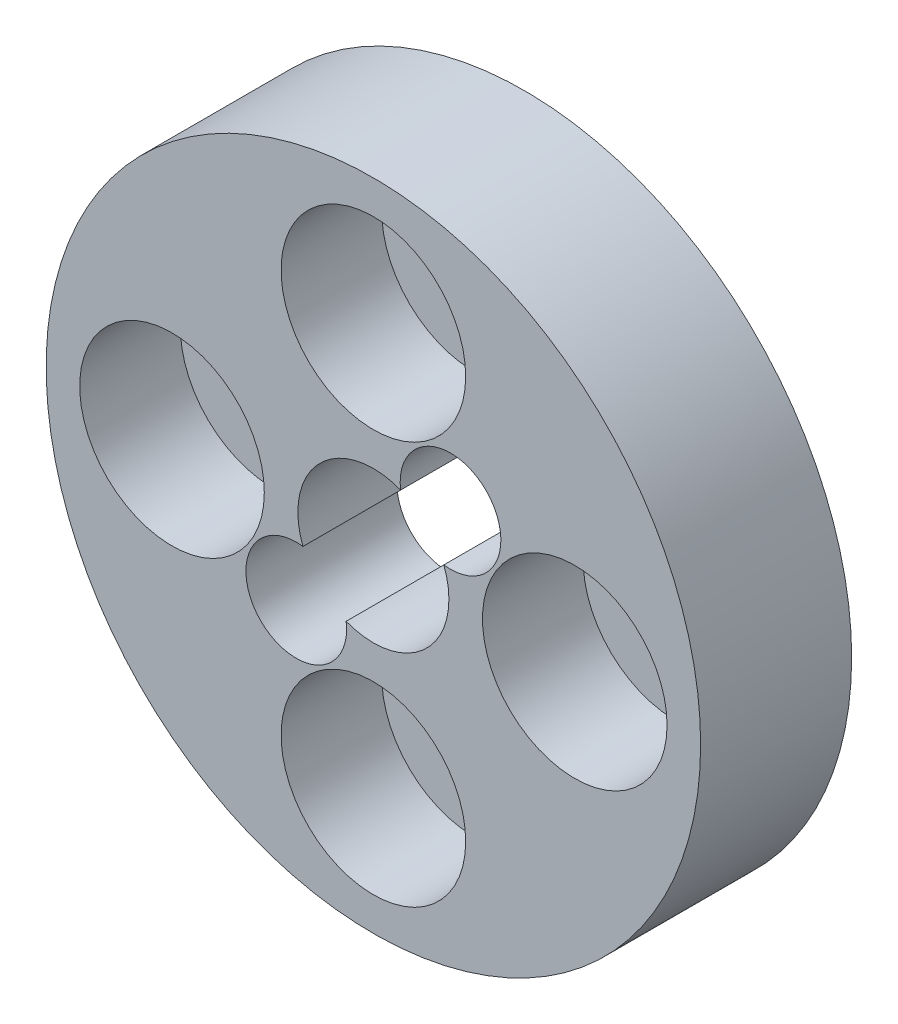
ISO-10303-21;
HEADER;
FILE_DESCRIPTION(('STEP AP214'),'2;1');
FILE_NAME('part.step','',(''),(''),'','','');
FILE_SCHEMA(('AUTOMOTIVE_DESIGN { 1 0 10303 214 1 1 1 1 }'));
ENDSEC;
DATA;
#1=APPLICATION_CONTEXT('core data for automotive mechanical design processes');
#2=APPLICATION_PROTOCOL_DEFINITION('international standard','automotive_design',2000,#1);
#3=PRODUCT_CONTEXT('',#1,'mechanical');
#4=PRODUCT('Part','Part','',(#3));
#5=PRODUCT_RELATED_PRODUCT_CATEGORY('part','',(#4));
#6=PRODUCT_DEFINITION_FORMATION('','',#4);
#7=PRODUCT_DEFINITION_CONTEXT('part definition',#1,'design');
#8=PRODUCT_DEFINITION('design','',#6,#7);
#9=PRODUCT_DEFINITION_SHAPE('','',#8);
#10=(LENGTH_UNIT() NAMED_UNIT(*) SI_UNIT(.MILLI.,.METRE.));
#11=(NAMED_UNIT(*) PLANE_ANGLE_UNIT() SI_UNIT($,.RADIAN.));
#12=(NAMED_UNIT(*) SI_UNIT($,.STERADIAN.) SOLID_ANGLE_UNIT());
#13=UNCERTAINTY_MEASURE_WITH_UNIT(LENGTH_MEASURE(1.E-05),#10,'distance_accuracy_value','');
#14=(GEOMETRIC_REPRESENTATION_CONTEXT(3) GLOBAL_UNCERTAINTY_ASSIGNED_CONTEXT((#13)) GLOBAL_UNIT_ASSIGNED_CONTEXT((#10,
#11,#12)) REPRESENTATION_CONTEXT('',''));
#15=CARTESIAN_POINT('',(0.,0.,0.));
#16=DIRECTION('',(0.,0.,1.));
#17=DIRECTION('',(1.,0.,0.));
#18=AXIS2_PLACEMENT_3D('',#15,#16,#17);
#19=CARTESIAN_POINT('',(0.,6.,4.5));
#20=DIRECTION('',(0.,0.,-1.));
#21=DIRECTION('',(-1.,0.,0.));
#22=AXIS2_PLACEMENT_3D('',#19,#20,#21);
#23=CYLINDRICAL_SURFACE('',#22,1.5);
#24=CARTESIAN_POINT('',(0.,6.,0.));
#25=DIRECTION('',(0.,0.,1.));
#26=DIRECTION('',(1.,0.,0.));
#27=AXIS2_PLACEMENT_3D('',#24,#25,#26);
#28=CIRCLE('',#27,1.5);
#29=CARTESIAN_POINT('',(1.5,6.,0.));
#30=VERTEX_POINT('',#29);
#31=EDGE_CURVE('E112',#30,#30,#28,.T.);
#32=ORIENTED_EDGE('',*,*,#31,.F.);
#33=EDGE_LOOP('',(#32));
#34=FACE_BOUND('',#33,.T.);
#35=CARTESIAN_POINT('',(0.,6.,1.5));
#36=DIRECTION('',(0.,0.,1.));
#37=DIRECTION('',(1.,0.,0.));
#38=AXIS2_PLACEMENT_3D('',#35,#36,#37);
#39=CIRCLE('',#38,1.5);
#40=CARTESIAN_POINT('',(1.5,6.,1.5));
#41=VERTEX_POINT('',#40);
#42=EDGE_CURVE('E42',#41,#41,#39,.T.);
#43=ORIENTED_EDGE('',*,*,#42,.T.);
#44=EDGE_LOOP('',(#43));
#45=FACE_BOUND('',#44,.T.);
#46=ADVANCED_FACE('F38',(#34,#45),#23,.F.);
#47=CARTESIAN_POINT('',(6.,0.,4.5));
#48=DIRECTION('',(0.,0.,-1.));
#49=DIRECTION('',(-1.,0.,0.));
#50=AXIS2_PLACEMENT_3D('',#47,#48,#49);
#51=CYLINDRICAL_SURFACE('',#50,1.5);
#52=CARTESIAN_POINT('',(6.,0.,0.));
#53=DIRECTION('',(0.,0.,1.));
#54=DIRECTION('',(1.,0.,0.));
#55=AXIS2_PLACEMENT_3D('',#52,#53,#54);
#56=CIRCLE('',#55,1.5);
#57=CARTESIAN_POINT('',(7.5,0.,0.));
#58=VERTEX_POINT('',#57);
#59=EDGE_CURVE('E180',#58,#58,#56,.T.);
#60=ORIENTED_EDGE('',*,*,#59,.F.);
#61=EDGE_LOOP('',(#60));
#62=FACE_BOUND('',#61,.T.);
#63=CARTESIAN_POINT('',(6.,0.,1.5));
#64=DIRECTION('',(0.,0.,1.));
#65=DIRECTION('',(1.,0.,0.));
#66=AXIS2_PLACEMENT_3D('',#63,#64,#65);
#67=CIRCLE('',#66,1.5);
#68=CARTESIAN_POINT('',(7.5,0.,1.5));
#69=VERTEX_POINT('',#68);
#70=EDGE_CURVE('E133',#69,#69,#67,.T.);
#71=ORIENTED_EDGE('',*,*,#70,.T.);
#72=EDGE_LOOP('',(#71));
#73=FACE_BOUND('',#72,.T.);
#74=ADVANCED_FACE('F192',(#62,#73),#51,.F.);
#75=CARTESIAN_POINT('',(0.,-6.,4.5));
#76=DIRECTION('',(0.,0.,-1.));
#77=DIRECTION('',(-1.,0.,0.));
#78=AXIS2_PLACEMENT_3D('',#75,#76,#77);
#79=CYLINDRICAL_SURFACE('',#78,1.5);
#80=CARTESIAN_POINT('',(0.,-6.,0.));
#81=DIRECTION('',(0.,0.,1.));
#82=DIRECTION('',(1.,0.,0.));
#83=AXIS2_PLACEMENT_3D('',#80,#81,#82);
#84=CIRCLE('',#83,1.5);
#85=CARTESIAN_POINT('',(1.5,-6.,0.));
#86=VERTEX_POINT('',#85);
#87=EDGE_CURVE('E177',#86,#86,#84,.T.);
#88=ORIENTED_EDGE('',*,*,#87,.F.);
#89=EDGE_LOOP('',(#88));
#90=FACE_BOUND('',#89,.T.);
#91=CARTESIAN_POINT('',(0.,-6.,1.5));
#92=DIRECTION('',(0.,0.,1.));
#93=DIRECTION('',(1.,0.,0.));
#94=AXIS2_PLACEMENT_3D('',#91,#92,#93);
#95=CIRCLE('',#94,1.5);
#96=CARTESIAN_POINT('',(1.5,-6.,1.5));
#97=VERTEX_POINT('',#96);
#98=EDGE_CURVE('E129',#97,#97,#95,.T.);
#99=ORIENTED_EDGE('',*,*,#98,.T.);
#100=EDGE_LOOP('',(#99));
#101=FACE_BOUND('',#100,.T.);
#102=ADVANCED_FACE('F198',(#90,#101),#79,.F.);
#103=CARTESIAN_POINT('',(-6.,0.,4.5));
#104=DIRECTION('',(0.,0.,-1.));
#105=DIRECTION('',(-1.,0.,0.));
#106=AXIS2_PLACEMENT_3D('',#103,#104,#105);
#107=CYLINDRICAL_SURFACE('',#106,1.5);
#108=CARTESIAN_POINT('',(-6.,0.,0.));
#109=DIRECTION('',(0.,0.,1.));
#110=DIRECTION('',(1.,0.,0.));
#111=AXIS2_PLACEMENT_3D('',#108,#109,#110);
#112=CIRCLE('',#111,1.5);
#113=CARTESIAN_POINT('',(-4.5,0.,0.));
#114=VERTEX_POINT('',#113);
#115=EDGE_CURVE('E169',#114,#114,#112,.T.);
#116=ORIENTED_EDGE('',*,*,#115,.F.);
#117=EDGE_LOOP('',(#116));
#118=FACE_BOUND('',#117,.T.);
#119=CARTESIAN_POINT('',(-6.,0.,1.5));
#120=DIRECTION('',(0.,0.,1.));
#121=DIRECTION('',(1.,0.,0.));
#122=AXIS2_PLACEMENT_3D('',#119,#120,#121);
#123=CIRCLE('',#122,1.5);
#124=CARTESIAN_POINT('',(-4.5,0.,1.5));
#125=VERTEX_POINT('',#124);
#126=EDGE_CURVE('E125',#125,#125,#123,.T.);
#127=ORIENTED_EDGE('',*,*,#126,.T.);
#128=EDGE_LOOP('',(#127));
#129=FACE_BOUND('',#128,.T.);
#130=ADVANCED_FACE('F234',(#118,#129),#107,.F.);
#131=CARTESIAN_POINT('',(0.,0.,4.5));
#132=DIRECTION('',(0.,0.,-1.));
#133=DIRECTION('',(-1.,0.,0.));
#134=AXIS2_PLACEMENT_3D('',#131,#132,#133);
#135=CYLINDRICAL_SURFACE('',#134,2.25);
#136=DIRECTION('',(0.,0.,1.));
#137=VECTOR('',#136,1.);
#138=CARTESIAN_POINT('',(2.09859282016007,0.811423548569188,2.25));
#139=LINE('',#138,#137);
#140=CARTESIAN_POINT('',(2.09859282016007,0.811423548569189,0.));
#141=VERTEX_POINT('',#140);
#142=CARTESIAN_POINT('',(2.09859282016007,0.811423548569189,4.5));
#143=VERTEX_POINT('',#142);
#144=EDGE_CURVE('E11',#141,#143,#139,.T.);
#145=ORIENTED_EDGE('',*,*,#144,.F.);
#146=CARTESIAN_POINT('',(0.,0.,0.));
#147=DIRECTION('',(0.,0.,1.));
#148=DIRECTION('',(1.,0.,0.));
#149=AXIS2_PLACEMENT_3D('',#146,#147,#148);
#150=CIRCLE('',#149,2.25);
#151=CARTESIAN_POINT('',(-0.811423548569179,-2.09859282016007,0.));
#152=VERTEX_POINT('',#151);
#153=EDGE_CURVE('E114',#152,#141,#150,.T.);
#154=ORIENTED_EDGE('',*,*,#153,.F.);
#155=DIRECTION('',(0.,0.,1.));
#156=VECTOR('',#155,1.);
#157=CARTESIAN_POINT('',(-0.811423548569179,-2.09859282016007,2.25));
#158=LINE('',#157,#156);
#159=CARTESIAN_POINT('',(-0.811423548569179,-2.09859282016007,4.5));
#160=VERTEX_POINT('',#159);
#161=EDGE_CURVE('E88',#160,#152,#158,.F.);
#162=ORIENTED_EDGE('',*,*,#161,.F.);
#163=CARTESIAN_POINT('',(0.,0.,4.5));
#164=DIRECTION('',(0.,0.,1.));
#165=DIRECTION('',(1.,0.,0.));
#166=AXIS2_PLACEMENT_3D('',#163,#164,#165);
#167=CIRCLE('',#166,2.25);
#168=EDGE_CURVE('E97',#160,#143,#167,.T.);
#169=ORIENTED_EDGE('',*,*,#168,.T.);
#170=EDGE_LOOP('',(#145,#154,#162,#169));
#171=FACE_BOUND('',#170,.T.);
#172=ADVANCED_FACE('F205',(#171),#135,.F.);
#173=CARTESIAN_POINT('',(0.,0.,4.5));
#174=DIRECTION('',(0.,0.,1.));
#175=DIRECTION('',(1.,0.,0.));
#176=AXIS2_PLACEMENT_3D('',#173,#174,#175);
#177=PLANE('',#176);
#178=CARTESIAN_POINT('',(6.,0.,4.5));
#179=DIRECTION('',(0.,0.,1.));
#180=DIRECTION('',(1.,0.,0.));
#181=AXIS2_PLACEMENT_3D('',#178,#179,#180);
#182=CIRCLE('',#181,2.75);
#183=CARTESIAN_POINT('',(8.75,0.,4.5));
#184=VERTEX_POINT('',#183);
#185=EDGE_CURVE('E256',#184,#184,#182,.T.);
#186=ORIENTED_EDGE('',*,*,#185,.F.);
#187=EDGE_LOOP('',(#186));
#188=FACE_BOUND('',#187,.T.);
#189=CARTESIAN_POINT('',(0.,-6.,4.5));
#190=DIRECTION('',(0.,0.,1.));
#191=DIRECTION('',(1.,0.,0.));
#192=AXIS2_PLACEMENT_3D('',#189,#190,#191);
#193=CIRCLE('',#192,2.75);
#194=CARTESIAN_POINT('',(2.75,-6.,4.5));
#195=VERTEX_POINT('',#194);
#196=EDGE_CURVE('E257',#195,#195,#193,.T.);
#197=ORIENTED_EDGE('',*,*,#196,.F.);
#198=EDGE_LOOP('',(#197));
#199=FACE_BOUND('',#198,.T.);
#200=CARTESIAN_POINT('',(-6.,0.,4.5));
#201=DIRECTION('',(0.,0.,1.));
#202=DIRECTION('',(1.,0.,0.));
#203=AXIS2_PLACEMENT_3D('',#200,#201,#202);
#204=CIRCLE('',#203,2.75);
#205=CARTESIAN_POINT('',(-3.25,0.,4.5));
#206=VERTEX_POINT('',#205);
#207=EDGE_CURVE('E153',#206,#206,#204,.T.);
#208=ORIENTED_EDGE('',*,*,#207,.F.);
#209=EDGE_LOOP('',(#208));
#210=FACE_BOUND('',#209,.T.);
#211=CARTESIAN_POINT('',(0.,6.,4.5));
#212=DIRECTION('',(0.,0.,1.));
#213=DIRECTION('',(1.,0.,0.));
#214=AXIS2_PLACEMENT_3D('',#211,#212,#213);
#215=CIRCLE('',#214,2.75);
#216=CARTESIAN_POINT('',(2.75,6.,4.5));
#217=VERTEX_POINT('',#216);
#218=EDGE_CURVE('E154',#217,#217,#215,.T.);
#219=ORIENTED_EDGE('',*,*,#218,.F.);
#220=EDGE_LOOP('',(#219));
#221=FACE_BOUND('',#220,.T.);
#222=CARTESIAN_POINT('',(2.29809703885627,2.29809703885628,4.5));
#223=DIRECTION('',(0.,0.,1.));
#224=DIRECTION('',(1.,0.,0.));
#225=AXIS2_PLACEMENT_3D('',#222,#223,#224);
#226=CIRCLE('',#225,1.5);
#227=CARTESIAN_POINT('',(0.81142354856918,2.09859282016007,4.5));
#228=VERTEX_POINT('',#227);
#229=EDGE_CURVE('E63',#143,#228,#226,.T.);
#230=ORIENTED_EDGE('',*,*,#229,.F.);
#231=ORIENTED_EDGE('',*,*,#168,.F.);
#232=CARTESIAN_POINT('',(-2.29809703885627,-2.29809703885628,4.5));
#233=DIRECTION('',(0.,0.,1.));
#234=DIRECTION('',(1.,0.,0.));
#235=AXIS2_PLACEMENT_3D('',#232,#233,#234);
#236=CIRCLE('',#235,1.5);
#237=CARTESIAN_POINT('',(-2.09859282016007,-0.811423548569188,4.5));
#238=VERTEX_POINT('',#237);
#239=EDGE_CURVE('E56',#238,#160,#236,.T.);
#240=ORIENTED_EDGE('',*,*,#239,.F.);
#241=EDGE_CURVE('E95',#228,#238,#167,.T.);
#242=ORIENTED_EDGE('',*,*,#241,.F.);
#243=EDGE_LOOP('',(#230,#231,#240,#242));
#244=FACE_BOUND('',#243,.T.);
#245=CARTESIAN_POINT('',(0.,0.,4.5));
#246=DIRECTION('',(0.,0.,1.));
#247=DIRECTION('',(1.,0.,0.));
#248=AXIS2_PLACEMENT_3D('',#245,#246,#247);
#249=CIRCLE('',#248,9.75);
#250=CARTESIAN_POINT('',(9.75,0.,4.5));
#251=VERTEX_POINT('',#250);
#252=EDGE_CURVE('E107',#251,#251,#249,.T.);
#253=ORIENTED_EDGE('',*,*,#252,.T.);
#254=EDGE_LOOP('',(#253));
#255=FACE_BOUND('',#254,.T.);
#256=ADVANCED_FACE('F93',(#188,#199,#210,#221,#244,#255),#177,.T.);
#257=CARTESIAN_POINT('',(0.,0.,0.));
#258=DIRECTION('',(0.,0.,1.));
#259=DIRECTION('',(1.,0.,0.));
#260=AXIS2_PLACEMENT_3D('',#257,#258,#259);
#261=PLANE('',#260);
#262=CARTESIAN_POINT('',(0.,0.,0.));
#263=DIRECTION('',(0.,0.,1.));
#264=DIRECTION('',(1.,0.,0.));
#265=AXIS2_PLACEMENT_3D('',#262,#263,#264);
#266=CIRCLE('',#265,9.75);
#267=CARTESIAN_POINT('',(9.75,0.,0.));
#268=VERTEX_POINT('',#267);
#269=EDGE_CURVE('E102',#268,#268,#266,.T.);
#270=ORIENTED_EDGE('',*,*,#269,.F.);
#271=EDGE_LOOP('',(#270));
#272=FACE_BOUND('',#271,.T.);
#273=ORIENTED_EDGE('',*,*,#153,.T.);
#274=CARTESIAN_POINT('',(2.29809703885627,2.29809703885628,0.));
#275=DIRECTION('',(0.,0.,1.));
#276=DIRECTION('',(1.,0.,0.));
#277=AXIS2_PLACEMENT_3D('',#274,#275,#276);
#278=CIRCLE('',#277,1.5);
#279=CARTESIAN_POINT('',(0.81142354856918,2.09859282016007,0.));
#280=VERTEX_POINT('',#279);
#281=EDGE_CURVE('E165',#141,#280,#278,.T.);
#282=ORIENTED_EDGE('',*,*,#281,.T.);
#283=CARTESIAN_POINT('',(-2.09859282016007,-0.811423548569188,0.));
#284=VERTEX_POINT('',#283);
#285=EDGE_CURVE('E109',#280,#284,#150,.T.);
#286=ORIENTED_EDGE('',*,*,#285,.T.);
#287=CARTESIAN_POINT('',(-2.29809703885627,-2.29809703885628,0.));
#288=DIRECTION('',(0.,0.,1.));
#289=DIRECTION('',(1.,0.,0.));
#290=AXIS2_PLACEMENT_3D('',#287,#288,#289);
#291=CIRCLE('',#290,1.5);
#292=EDGE_CURVE('E82',#284,#152,#291,.T.);
#293=ORIENTED_EDGE('',*,*,#292,.T.);
#294=EDGE_LOOP('',(#273,#282,#286,#293));
#295=FACE_BOUND('',#294,.T.);
#296=ORIENTED_EDGE('',*,*,#31,.T.);
#297=EDGE_LOOP('',(#296));
#298=FACE_BOUND('',#297,.T.);
#299=ORIENTED_EDGE('',*,*,#59,.T.);
#300=EDGE_LOOP('',(#299));
#301=FACE_BOUND('',#300,.T.);
#302=ORIENTED_EDGE('',*,*,#87,.T.);
#303=EDGE_LOOP('',(#302));
#304=FACE_BOUND('',#303,.T.);
#305=ORIENTED_EDGE('',*,*,#115,.T.);
#306=EDGE_LOOP('',(#305));
#307=FACE_BOUND('',#306,.T.);
#308=ADVANCED_FACE('F189',(#272,#295,#298,#301,#304,#307),#261,.F.);
#309=CARTESIAN_POINT('',(0.,0.,4.5));
#310=DIRECTION('',(0.,0.,-1.));
#311=DIRECTION('',(-1.,0.,0.));
#312=AXIS2_PLACEMENT_3D('',#309,#310,#311);
#313=CYLINDRICAL_SURFACE('',#312,9.75);
#314=ORIENTED_EDGE('',*,*,#252,.F.);
#315=EDGE_LOOP('',(#314));
#316=FACE_BOUND('',#315,.T.);
#317=ORIENTED_EDGE('',*,*,#269,.T.);
#318=EDGE_LOOP('',(#317));
#319=FACE_BOUND('',#318,.T.);
#320=ADVANCED_FACE('F40',(#316,#319),#313,.T.);
#321=DIRECTION('',(0.,0.,1.));
#322=VECTOR('',#321,1.);
#323=CARTESIAN_POINT('',(0.81142354856918,2.09859282016007,2.25));
#324=LINE('',#323,#322);
#325=EDGE_CURVE('E48',#228,#280,#324,.F.);
#326=ORIENTED_EDGE('',*,*,#325,.F.);
#327=ORIENTED_EDGE('',*,*,#241,.T.);
#328=DIRECTION('',(0.,0.,1.));
#329=VECTOR('',#328,1.);
#330=CARTESIAN_POINT('',(-2.09859282016007,-0.811423548569188,2.25));
#331=LINE('',#330,#329);
#332=EDGE_CURVE('E79',#284,#238,#331,.T.);
#333=ORIENTED_EDGE('',*,*,#332,.F.);
#334=ORIENTED_EDGE('',*,*,#285,.F.);
#335=EDGE_LOOP('',(#326,#327,#333,#334));
#336=FACE_BOUND('',#335,.T.);
#337=ADVANCED_FACE('F100',(#336),#135,.F.);
#338=CARTESIAN_POINT('',(-2.29809703885627,-2.29809703885628,0.));
#339=DIRECTION('',(0.,0.,1.));
#340=DIRECTION('',(1.,0.,0.));
#341=AXIS2_PLACEMENT_3D('',#338,#339,#340);
#342=CYLINDRICAL_SURFACE('',#341,1.5);
#343=ORIENTED_EDGE('',*,*,#332,.T.);
#344=ORIENTED_EDGE('',*,*,#239,.T.);
#345=ORIENTED_EDGE('',*,*,#161,.T.);
#346=ORIENTED_EDGE('',*,*,#292,.F.);
#347=EDGE_LOOP('',(#343,#344,#345,#346));
#348=FACE_BOUND('',#347,.T.);
#349=ADVANCED_FACE('F80',(#348),#342,.F.);
#350=CARTESIAN_POINT('',(2.29809703885627,2.29809703885628,0.));
#351=DIRECTION('',(0.,0.,1.));
#352=DIRECTION('',(1.,0.,0.));
#353=AXIS2_PLACEMENT_3D('',#350,#351,#352);
#354=CYLINDRICAL_SURFACE('',#353,1.5);
#355=ORIENTED_EDGE('',*,*,#144,.T.);
#356=ORIENTED_EDGE('',*,*,#229,.T.);
#357=ORIENTED_EDGE('',*,*,#325,.T.);
#358=ORIENTED_EDGE('',*,*,#281,.F.);
#359=EDGE_LOOP('',(#355,#356,#357,#358));
#360=FACE_BOUND('',#359,.T.);
#361=ADVANCED_FACE('F220',(#360),#354,.F.);
#362=CARTESIAN_POINT('',(-6.,0.,1.5));
#363=DIRECTION('',(0.,0.,1.));
#364=DIRECTION('',(1.,0.,0.));
#365=AXIS2_PLACEMENT_3D('',#362,#363,#364);
#366=CYLINDRICAL_SURFACE('',#365,2.75);
#367=CARTESIAN_POINT('',(-6.,0.,1.5));
#368=DIRECTION('',(0.,0.,1.));
#369=DIRECTION('',(1.,0.,0.));
#370=AXIS2_PLACEMENT_3D('',#367,#368,#369);
#371=CIRCLE('',#370,2.75);
#372=CARTESIAN_POINT('',(-3.25,0.,1.5));
#373=VERTEX_POINT('',#372);
#374=EDGE_CURVE('E159',#373,#373,#371,.T.);
#375=ORIENTED_EDGE('',*,*,#374,.F.);
#376=EDGE_LOOP('',(#375));
#377=FACE_BOUND('',#376,.T.);
#378=ORIENTED_EDGE('',*,*,#207,.T.);
#379=EDGE_LOOP('',(#378));
#380=FACE_BOUND('',#379,.T.);
#381=ADVANCED_FACE('F222',(#377,#380),#366,.F.);
#382=CARTESIAN_POINT('',(-6.,0.,1.5));
#383=DIRECTION('',(0.,0.,1.));
#384=DIRECTION('',(1.,0.,0.));
#385=AXIS2_PLACEMENT_3D('',#382,#383,#384);
#386=PLANE('',#385);
#387=ORIENTED_EDGE('',*,*,#126,.F.);
#388=EDGE_LOOP('',(#387));
#389=FACE_BOUND('',#388,.T.);
#390=ORIENTED_EDGE('',*,*,#374,.T.);
#391=EDGE_LOOP('',(#390));
#392=FACE_BOUND('',#391,.T.);
#393=ADVANCED_FACE('F228',(#389,#392),#386,.T.);
#394=CARTESIAN_POINT('',(0.,-6.,1.5));
#395=DIRECTION('',(0.,0.,1.));
#396=DIRECTION('',(1.,0.,0.));
#397=AXIS2_PLACEMENT_3D('',#394,#395,#396);
#398=CYLINDRICAL_SURFACE('',#397,2.75);
#399=CARTESIAN_POINT('',(0.,-6.,1.5));
#400=DIRECTION('',(0.,0.,1.));
#401=DIRECTION('',(1.,0.,0.));
#402=AXIS2_PLACEMENT_3D('',#399,#400,#401);
#403=CIRCLE('',#402,2.75);
#404=CARTESIAN_POINT('',(2.75,-6.,1.5));
#405=VERTEX_POINT('',#404);
#406=EDGE_CURVE('E253',#405,#405,#403,.T.);
#407=ORIENTED_EDGE('',*,*,#406,.F.);
#408=EDGE_LOOP('',(#407));
#409=FACE_BOUND('',#408,.T.);
#410=ORIENTED_EDGE('',*,*,#196,.T.);
#411=EDGE_LOOP('',(#410));
#412=FACE_BOUND('',#411,.T.);
#413=ADVANCED_FACE('F249',(#409,#412),#398,.F.);
#414=CARTESIAN_POINT('',(0.,-6.,1.5));
#415=DIRECTION('',(0.,0.,1.));
#416=DIRECTION('',(1.,0.,0.));
#417=AXIS2_PLACEMENT_3D('',#414,#415,#416);
#418=PLANE('',#417);
#419=ORIENTED_EDGE('',*,*,#98,.F.);
#420=EDGE_LOOP('',(#419));
#421=FACE_BOUND('',#420,.T.);
#422=ORIENTED_EDGE('',*,*,#406,.T.);
#423=EDGE_LOOP('',(#422));
#424=FACE_BOUND('',#423,.T.);
#425=ADVANCED_FACE('F245',(#421,#424),#418,.T.);
#426=CARTESIAN_POINT('',(6.,0.,1.5));
#427=DIRECTION('',(0.,0.,1.));
#428=DIRECTION('',(1.,0.,0.));
#429=AXIS2_PLACEMENT_3D('',#426,#427,#428);
#430=CYLINDRICAL_SURFACE('',#429,2.75);
#431=CARTESIAN_POINT('',(6.,0.,1.5));
#432=DIRECTION('',(0.,0.,1.));
#433=DIRECTION('',(1.,0.,0.));
#434=AXIS2_PLACEMENT_3D('',#431,#432,#433);
#435=CIRCLE('',#434,2.75);
#436=CARTESIAN_POINT('',(8.75,0.,1.5));
#437=VERTEX_POINT('',#436);
#438=EDGE_CURVE('E130',#437,#437,#435,.T.);
#439=ORIENTED_EDGE('',*,*,#438,.F.);
#440=EDGE_LOOP('',(#439));
#441=FACE_BOUND('',#440,.T.);
#442=ORIENTED_EDGE('',*,*,#185,.T.);
#443=EDGE_LOOP('',(#442));
#444=FACE_BOUND('',#443,.T.);
#445=ADVANCED_FACE('F248',(#441,#444),#430,.F.);
#446=CARTESIAN_POINT('',(6.,0.,1.5));
#447=DIRECTION('',(0.,0.,1.));
#448=DIRECTION('',(1.,0.,0.));
#449=AXIS2_PLACEMENT_3D('',#446,#447,#448);
#450=PLANE('',#449);
#451=ORIENTED_EDGE('',*,*,#70,.F.);
#452=EDGE_LOOP('',(#451));
#453=FACE_BOUND('',#452,.T.);
#454=ORIENTED_EDGE('',*,*,#438,.T.);
#455=EDGE_LOOP('',(#454));
#456=FACE_BOUND('',#455,.T.);
#457=ADVANCED_FACE('F277',(#453,#456),#450,.T.);
#458=CARTESIAN_POINT('',(0.,6.,1.5));
#459=DIRECTION('',(0.,0.,1.));
#460=DIRECTION('',(1.,0.,0.));
#461=AXIS2_PLACEMENT_3D('',#458,#459,#460);
#462=CYLINDRICAL_SURFACE('',#461,2.75);
#463=CARTESIAN_POINT('',(0.,6.,1.5));
#464=DIRECTION('',(0.,0.,1.));
#465=DIRECTION('',(1.,0.,0.));
#466=AXIS2_PLACEMENT_3D('',#463,#464,#465);
#467=CIRCLE('',#466,2.75);
#468=CARTESIAN_POINT('',(2.75,6.,1.5));
#469=VERTEX_POINT('',#468);
#470=EDGE_CURVE('E150',#469,#469,#467,.T.);
#471=ORIENTED_EDGE('',*,*,#470,.F.);
#472=EDGE_LOOP('',(#471));
#473=FACE_BOUND('',#472,.T.);
#474=ORIENTED_EDGE('',*,*,#218,.T.);
#475=EDGE_LOOP('',(#474));
#476=FACE_BOUND('',#475,.T.);
#477=ADVANCED_FACE('F146',(#473,#476),#462,.F.);
#478=CARTESIAN_POINT('',(0.,6.,1.5));
#479=DIRECTION('',(0.,0.,1.));
#480=DIRECTION('',(1.,0.,0.));
#481=AXIS2_PLACEMENT_3D('',#478,#479,#480);
#482=PLANE('',#481);
#483=ORIENTED_EDGE('',*,*,#42,.F.);
#484=EDGE_LOOP('',(#483));
#485=FACE_BOUND('',#484,.T.);
#486=ORIENTED_EDGE('',*,*,#470,.T.);
#487=EDGE_LOOP('',(#486));
#488=FACE_BOUND('',#487,.T.);
#489=ADVANCED_FACE('F143',(#485,#488),#482,.T.);
#490=CLOSED_SHELL('',(#46,#74,#102,#130,#172,#256,#308,#320,#337,#349,#361,#381,#393,#413,#425,
#445,#457,#477,#489));
#491=MANIFOLD_SOLID_BREP('B2',#490);
#492=ADVANCED_BREP_SHAPE_REPRESENTATION('',(#18,#491),#14);
#493=SHAPE_DEFINITION_REPRESENTATION(#9,#492);
ENDSEC;
END-ISO-10303-21;
